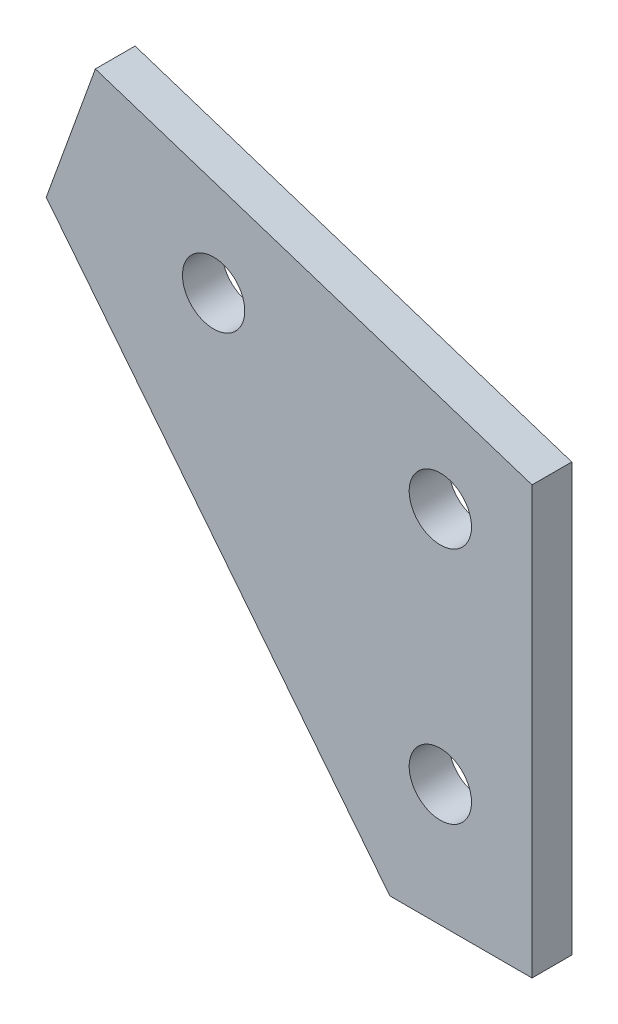
ISO-10303-21;
HEADER;
FILE_DESCRIPTION(('STEP AP214'),'2;1');
FILE_NAME('part.step','',(''),(''),'','','');
FILE_SCHEMA(('AUTOMOTIVE_DESIGN { 1 0 10303 214 1 1 1 1 }'));
ENDSEC;
DATA;
#1=APPLICATION_CONTEXT('core data for automotive mechanical design processes');
#2=APPLICATION_PROTOCOL_DEFINITION('international standard','automotive_design',2000,#1);
#3=PRODUCT_CONTEXT('',#1,'mechanical');
#4=PRODUCT('Part','Part','',(#3));
#5=PRODUCT_RELATED_PRODUCT_CATEGORY('part','',(#4));
#6=PRODUCT_DEFINITION_FORMATION('','',#4);
#7=PRODUCT_DEFINITION_CONTEXT('part definition',#1,'design');
#8=PRODUCT_DEFINITION('design','',#6,#7);
#9=PRODUCT_DEFINITION_SHAPE('','',#8);
#10=(LENGTH_UNIT() NAMED_UNIT(*) SI_UNIT(.MILLI.,.METRE.));
#11=(NAMED_UNIT(*) PLANE_ANGLE_UNIT() SI_UNIT($,.RADIAN.));
#12=(NAMED_UNIT(*) SI_UNIT($,.STERADIAN.) SOLID_ANGLE_UNIT());
#13=UNCERTAINTY_MEASURE_WITH_UNIT(LENGTH_MEASURE(1.E-05),#10,'distance_accuracy_value','');
#14=(GEOMETRIC_REPRESENTATION_CONTEXT(3) GLOBAL_UNCERTAINTY_ASSIGNED_CONTEXT((#13)) GLOBAL_UNIT_ASSIGNED_CONTEXT((#10,
#11,#12)) REPRESENTATION_CONTEXT('',''));
#15=CARTESIAN_POINT('',(0.,0.,0.));
#16=DIRECTION('',(0.,0.,1.));
#17=DIRECTION('',(1.,0.,0.));
#18=AXIS2_PLACEMENT_3D('',#15,#16,#17);
#19=CARTESIAN_POINT('',(-42.1889289657337,293.91943691693,3.175));
#20=DIRECTION('',(0.940285653134001,-0.340386384143616,0.));
#21=DIRECTION('',(0.340386384143616,0.940285653134001,0.));
#22=AXIS2_PLACEMENT_3D('',#19,#20,#21);
#23=PLANE('',#22);
#24=DIRECTION('',(-0.340386384143616,-0.940285653134001,0.));
#25=VECTOR('',#24,1.);
#26=CARTESIAN_POINT('',(-42.1889289657337,293.91943691693,0.));
#27=LINE('',#26,#25);
#28=CARTESIAN_POINT('',(-42.1889289657337,293.91943691693,0.));
#29=VERTEX_POINT('',#28);
#30=CARTESIAN_POINT('',(-46.1134447942971,283.078327809761,0.));
#31=VERTEX_POINT('',#30);
#32=EDGE_CURVE('E111',#29,#31,#27,.T.);
#33=ORIENTED_EDGE('',*,*,#32,.T.);
#34=DIRECTION('',(0.,0.,-1.));
#35=VECTOR('',#34,1.);
#36=CARTESIAN_POINT('',(-46.1134447942971,283.078327809761,3.175));
#37=LINE('',#36,#35);
#38=CARTESIAN_POINT('',(-46.1134447942971,283.078327809761,3.175));
#39=VERTEX_POINT('',#38);
#40=EDGE_CURVE('E11',#39,#31,#37,.T.);
#41=ORIENTED_EDGE('',*,*,#40,.F.);
#42=DIRECTION('',(-0.340386384143616,-0.940285653134001,0.));
#43=VECTOR('',#42,1.);
#44=CARTESIAN_POINT('',(-42.1889289657337,293.91943691693,3.175));
#45=LINE('',#44,#43);
#46=CARTESIAN_POINT('',(-42.1889289657337,293.91943691693,3.175));
#47=VERTEX_POINT('',#46);
#48=EDGE_CURVE('E120',#47,#39,#45,.T.);
#49=ORIENTED_EDGE('',*,*,#48,.F.);
#50=DIRECTION('',(0.,0.,-1.));
#51=VECTOR('',#50,1.);
#52=CARTESIAN_POINT('',(-42.1889289657337,293.91943691693,3.175));
#53=LINE('',#52,#51);
#54=EDGE_CURVE('E107',#47,#29,#53,.T.);
#55=ORIENTED_EDGE('',*,*,#54,.T.);
#56=EDGE_LOOP('',(#33,#41,#49,#55));
#57=FACE_BOUND('',#56,.T.);
#58=ADVANCED_FACE('F37',(#57),#23,.F.);
#59=CARTESIAN_POINT('',(-18.6536756946853,248.458198081122,3.175));
#60=DIRECTION('',(0.783470961767866,0.621428396572393,0.));
#61=DIRECTION('',(-0.621428396572393,0.783470961767866,0.));
#62=AXIS2_PLACEMENT_3D('',#59,#60,#61);
#63=PLANE('',#62);
#64=DIRECTION('',(0.621428396572393,-0.783470961767866,0.));
#65=VECTOR('',#64,1.);
#66=CARTESIAN_POINT('',(-18.6536756946853,248.458198081122,0.));
#67=LINE('',#66,#65);
#68=CARTESIAN_POINT('',(-18.6536756946853,248.458198081122,0.));
#69=VERTEX_POINT('',#68);
#70=EDGE_CURVE('E114',#31,#69,#67,.T.);
#71=ORIENTED_EDGE('',*,*,#70,.T.);
#72=DIRECTION('',(0.,0.,-1.));
#73=VECTOR('',#72,1.);
#74=CARTESIAN_POINT('',(-18.6536756946853,248.458198081122,3.175));
#75=LINE('',#74,#73);
#76=CARTESIAN_POINT('',(-18.6536756946853,248.458198081122,3.175));
#77=VERTEX_POINT('',#76);
#78=EDGE_CURVE('E45',#77,#69,#75,.T.);
#79=ORIENTED_EDGE('',*,*,#78,.F.);
#80=DIRECTION('',(0.621428396572393,-0.783470961767866,0.));
#81=VECTOR('',#80,1.);
#82=CARTESIAN_POINT('',(-18.6536756946853,248.458198081122,3.175));
#83=LINE('',#82,#81);
#84=EDGE_CURVE('E87',#39,#77,#83,.T.);
#85=ORIENTED_EDGE('',*,*,#84,.F.);
#86=ORIENTED_EDGE('',*,*,#40,.T.);
#87=EDGE_LOOP('',(#71,#79,#85,#86));
#88=FACE_BOUND('',#87,.T.);
#89=ADVANCED_FACE('F140',(#88),#63,.F.);
#90=CARTESIAN_POINT('',(-7.29673504703683,248.458198081122,3.175));
#91=DIRECTION('',(0.,1.,0.));
#92=DIRECTION('',(-1.,0.,0.));
#93=AXIS2_PLACEMENT_3D('',#90,#91,#92);
#94=PLANE('',#93);
#95=DIRECTION('',(1.,0.,0.));
#96=VECTOR('',#95,1.);
#97=CARTESIAN_POINT('',(-7.29673504703683,248.458198081122,0.));
#98=LINE('',#97,#96);
#99=CARTESIAN_POINT('',(-7.29673504703683,248.458198081122,0.));
#100=VERTEX_POINT('',#99);
#101=EDGE_CURVE('E102',#69,#100,#98,.T.);
#102=ORIENTED_EDGE('',*,*,#101,.T.);
#103=DIRECTION('',(0.,0.,-1.));
#104=VECTOR('',#103,1.);
#105=CARTESIAN_POINT('',(-7.29673504703683,248.458198081122,3.175));
#106=LINE('',#105,#104);
#107=CARTESIAN_POINT('',(-7.29673504703683,248.458198081122,3.175));
#108=VERTEX_POINT('',#107);
#109=EDGE_CURVE('E99',#108,#100,#106,.T.);
#110=ORIENTED_EDGE('',*,*,#109,.F.);
#111=DIRECTION('',(1.,0.,0.));
#112=VECTOR('',#111,1.);
#113=CARTESIAN_POINT('',(-7.29673504703683,248.458198081122,3.175));
#114=LINE('',#113,#112);
#115=EDGE_CURVE('E91',#77,#108,#114,.T.);
#116=ORIENTED_EDGE('',*,*,#115,.F.);
#117=ORIENTED_EDGE('',*,*,#78,.T.);
#118=EDGE_LOOP('',(#102,#110,#116,#117));
#119=FACE_BOUND('',#118,.T.);
#120=ADVANCED_FACE('F100',(#119),#94,.F.);
#121=CARTESIAN_POINT('',(-7.29673504703684,282.582275867962,3.175));
#122=DIRECTION('',(-1.,0.,0.));
#123=DIRECTION('',(0.,-1.,0.));
#124=AXIS2_PLACEMENT_3D('',#121,#122,#123);
#125=PLANE('',#124);
#126=DIRECTION('',(0.,1.,0.));
#127=VECTOR('',#126,1.);
#128=CARTESIAN_POINT('',(-7.29673504703684,282.582275867962,0.));
#129=LINE('',#128,#127);
#130=CARTESIAN_POINT('',(-7.29673504703684,282.582275867962,0.));
#131=VERTEX_POINT('',#130);
#132=EDGE_CURVE('E73',#100,#131,#129,.T.);
#133=ORIENTED_EDGE('',*,*,#132,.T.);
#134=DIRECTION('',(0.,0.,-1.));
#135=VECTOR('',#134,1.);
#136=CARTESIAN_POINT('',(-7.29673504703684,282.582275867962,3.175));
#137=LINE('',#136,#135);
#138=CARTESIAN_POINT('',(-7.29673504703684,282.582275867962,3.175));
#139=VERTEX_POINT('',#138);
#140=EDGE_CURVE('E103',#139,#131,#137,.T.);
#141=ORIENTED_EDGE('',*,*,#140,.F.);
#142=DIRECTION('',(0.,1.,0.));
#143=VECTOR('',#142,1.);
#144=CARTESIAN_POINT('',(-7.29673504703684,282.582275867962,3.175));
#145=LINE('',#144,#143);
#146=EDGE_CURVE('E95',#108,#139,#145,.T.);
#147=ORIENTED_EDGE('',*,*,#146,.F.);
#148=ORIENTED_EDGE('',*,*,#109,.T.);
#149=EDGE_LOOP('',(#133,#141,#147,#148));
#150=FACE_BOUND('',#149,.T.);
#151=ADVANCED_FACE('F105',(#150),#125,.F.);
#152=CARTESIAN_POINT('',(-42.1889289657337,293.91943691693,3.175));
#153=DIRECTION('',(-0.309016994375064,-0.951056516295116,0.));
#154=DIRECTION('',(0.951056516295116,-0.309016994375064,0.));
#155=AXIS2_PLACEMENT_3D('',#152,#153,#154);
#156=PLANE('',#155);
#157=DIRECTION('',(-0.951056516295116,0.309016994375064,0.));
#158=VECTOR('',#157,1.);
#159=CARTESIAN_POINT('',(-42.1889289657337,293.91943691693,0.));
#160=LINE('',#159,#158);
#161=EDGE_CURVE('E79',#131,#29,#160,.T.);
#162=ORIENTED_EDGE('',*,*,#161,.T.);
#163=ORIENTED_EDGE('',*,*,#54,.F.);
#164=DIRECTION('',(-0.951056516295116,0.309016994375064,0.));
#165=VECTOR('',#164,1.);
#166=CARTESIAN_POINT('',(-42.1889289657337,293.91943691693,3.175));
#167=LINE('',#166,#165);
#168=EDGE_CURVE('E53',#139,#47,#167,.T.);
#169=ORIENTED_EDGE('',*,*,#168,.F.);
#170=ORIENTED_EDGE('',*,*,#140,.T.);
#171=EDGE_LOOP('',(#162,#163,#169,#170));
#172=FACE_BOUND('',#171,.T.);
#173=ADVANCED_FACE('F128',(#172),#156,.F.);
#174=CARTESIAN_POINT('',(0.,0.,3.175));
#175=DIRECTION('',(0.,0.,1.));
#176=DIRECTION('',(1.,0.,0.));
#177=AXIS2_PLACEMENT_3D('',#174,#175,#176);
#178=PLANE('',#177);
#179=CARTESIAN_POINT('',(-32.7402519463279,283.138719962977,3.175));
#180=DIRECTION('',(0.,0.,1.));
#181=DIRECTION('',(1.,0.,0.));
#182=AXIS2_PLACEMENT_3D('',#179,#180,#181);
#183=CIRCLE('',#182,2.48919999999999);
#184=CARTESIAN_POINT('',(-30.2510519463279,283.138719962977,3.175));
#185=VERTEX_POINT('',#184);
#186=EDGE_CURVE('E242',#185,#185,#183,.T.);
#187=ORIENTED_EDGE('',*,*,#186,.F.);
#188=EDGE_LOOP('',(#187));
#189=FACE_BOUND('',#188,.T.);
#190=CARTESIAN_POINT('',(-14.6226253109059,277.251946220132,3.175));
#191=DIRECTION('',(0.,0.,1.));
#192=DIRECTION('',(1.,0.,0.));
#193=AXIS2_PLACEMENT_3D('',#190,#191,#192);
#194=CIRCLE('',#193,2.48919999999999);
#195=CARTESIAN_POINT('',(-12.1334253109059,277.251946220132,3.175));
#196=VERTEX_POINT('',#195);
#197=EDGE_CURVE('E244',#196,#196,#194,.T.);
#198=ORIENTED_EDGE('',*,*,#197,.F.);
#199=EDGE_LOOP('',(#198));
#200=FACE_BOUND('',#199,.T.);
#201=CARTESIAN_POINT('',(-14.6226253109059,258.201946220132,3.175));
#202=DIRECTION('',(0.,0.,1.));
#203=DIRECTION('',(1.,0.,0.));
#204=AXIS2_PLACEMENT_3D('',#201,#202,#203);
#205=CIRCLE('',#204,2.48919999999999);
#206=CARTESIAN_POINT('',(-12.133425310906,258.201946220132,3.175));
#207=VERTEX_POINT('',#206);
#208=EDGE_CURVE('E252',#207,#207,#205,.T.);
#209=ORIENTED_EDGE('',*,*,#208,.F.);
#210=EDGE_LOOP('',(#209));
#211=FACE_BOUND('',#210,.T.);
#212=ORIENTED_EDGE('',*,*,#48,.T.);
#213=ORIENTED_EDGE('',*,*,#84,.T.);
#214=ORIENTED_EDGE('',*,*,#115,.T.);
#215=ORIENTED_EDGE('',*,*,#146,.T.);
#216=ORIENTED_EDGE('',*,*,#168,.T.);
#217=EDGE_LOOP('',(#212,#213,#214,#215,#216));
#218=FACE_BOUND('',#217,.T.);
#219=ADVANCED_FACE('F93',(#189,#200,#211,#218),#178,.T.);
#220=CARTESIAN_POINT('',(0.,0.,0.));
#221=DIRECTION('',(0.,0.,1.));
#222=DIRECTION('',(1.,0.,0.));
#223=AXIS2_PLACEMENT_3D('',#220,#221,#222);
#224=PLANE('',#223);
#225=CARTESIAN_POINT('',(-32.7402519463279,283.138719962977,0.));
#226=DIRECTION('',(0.,0.,1.));
#227=DIRECTION('',(1.,0.,0.));
#228=AXIS2_PLACEMENT_3D('',#225,#226,#227);
#229=CIRCLE('',#228,2.4892);
#230=CARTESIAN_POINT('',(-30.2510519463279,283.138719962977,0.));
#231=VERTEX_POINT('',#230);
#232=EDGE_CURVE('E239',#231,#231,#229,.T.);
#233=ORIENTED_EDGE('',*,*,#232,.T.);
#234=EDGE_LOOP('',(#233));
#235=FACE_BOUND('',#234,.T.);
#236=CARTESIAN_POINT('',(-14.6226253109059,277.251946220132,0.));
#237=DIRECTION('',(0.,0.,1.));
#238=DIRECTION('',(1.,0.,0.));
#239=AXIS2_PLACEMENT_3D('',#236,#237,#238);
#240=CIRCLE('',#239,2.4892);
#241=CARTESIAN_POINT('',(-12.1334253109059,277.251946220132,0.));
#242=VERTEX_POINT('',#241);
#243=EDGE_CURVE('E249',#242,#242,#240,.T.);
#244=ORIENTED_EDGE('',*,*,#243,.T.);
#245=EDGE_LOOP('',(#244));
#246=FACE_BOUND('',#245,.T.);
#247=CARTESIAN_POINT('',(-14.6226253109059,258.201946220132,0.));
#248=DIRECTION('',(0.,0.,1.));
#249=DIRECTION('',(1.,0.,0.));
#250=AXIS2_PLACEMENT_3D('',#247,#248,#249);
#251=CIRCLE('',#250,2.4892);
#252=CARTESIAN_POINT('',(-12.1334253109059,258.201946220132,0.));
#253=VERTEX_POINT('',#252);
#254=EDGE_CURVE('E115',#253,#253,#251,.T.);
#255=ORIENTED_EDGE('',*,*,#254,.T.);
#256=EDGE_LOOP('',(#255));
#257=FACE_BOUND('',#256,.T.);
#258=ORIENTED_EDGE('',*,*,#32,.F.);
#259=ORIENTED_EDGE('',*,*,#161,.F.);
#260=ORIENTED_EDGE('',*,*,#132,.F.);
#261=ORIENTED_EDGE('',*,*,#101,.F.);
#262=ORIENTED_EDGE('',*,*,#70,.F.);
#263=EDGE_LOOP('',(#258,#259,#260,#261,#262));
#264=FACE_BOUND('',#263,.T.);
#265=ADVANCED_FACE('F124',(#235,#246,#257,#264),#224,.F.);
#266=CARTESIAN_POINT('',(-14.6226253109059,258.201946220132,3.175));
#267=DIRECTION('',(0.,0.,1.));
#268=DIRECTION('',(1.,0.,0.));
#269=AXIS2_PLACEMENT_3D('',#266,#267,#268);
#270=CYLINDRICAL_SURFACE('',#269,2.48919999999999);
#271=ORIENTED_EDGE('',*,*,#254,.F.);
#272=EDGE_LOOP('',(#271));
#273=FACE_BOUND('',#272,.T.);
#274=ORIENTED_EDGE('',*,*,#208,.T.);
#275=EDGE_LOOP('',(#274));
#276=FACE_BOUND('',#275,.T.);
#277=ADVANCED_FACE('F176',(#273,#276),#270,.F.);
#278=CARTESIAN_POINT('',(-14.6226253109059,277.251946220132,3.175));
#279=DIRECTION('',(0.,0.,1.));
#280=DIRECTION('',(1.,0.,0.));
#281=AXIS2_PLACEMENT_3D('',#278,#279,#280);
#282=CYLINDRICAL_SURFACE('',#281,2.48919999999999);
#283=ORIENTED_EDGE('',*,*,#243,.F.);
#284=EDGE_LOOP('',(#283));
#285=FACE_BOUND('',#284,.T.);
#286=ORIENTED_EDGE('',*,*,#197,.T.);
#287=EDGE_LOOP('',(#286));
#288=FACE_BOUND('',#287,.T.);
#289=ADVANCED_FACE('F186',(#285,#288),#282,.F.);
#290=CARTESIAN_POINT('',(-32.7402519463279,283.138719962977,3.175));
#291=DIRECTION('',(0.,0.,1.));
#292=DIRECTION('',(1.,0.,0.));
#293=AXIS2_PLACEMENT_3D('',#290,#291,#292);
#294=CYLINDRICAL_SURFACE('',#293,2.4892);
#295=ORIENTED_EDGE('',*,*,#232,.F.);
#296=EDGE_LOOP('',(#295));
#297=FACE_BOUND('',#296,.T.);
#298=ORIENTED_EDGE('',*,*,#186,.T.);
#299=EDGE_LOOP('',(#298));
#300=FACE_BOUND('',#299,.T.);
#301=ADVANCED_FACE('F197',(#297,#300),#294,.F.);
#302=CLOSED_SHELL('',(#58,#89,#120,#151,#173,#219,#265,#277,#289,#301));
#303=MANIFOLD_SOLID_BREP('B2',#302);
#304=ADVANCED_BREP_SHAPE_REPRESENTATION('',(#18,#303),#14);
#305=SHAPE_DEFINITION_REPRESENTATION(#9,#304);
ENDSEC;
END-ISO-10303-21;
